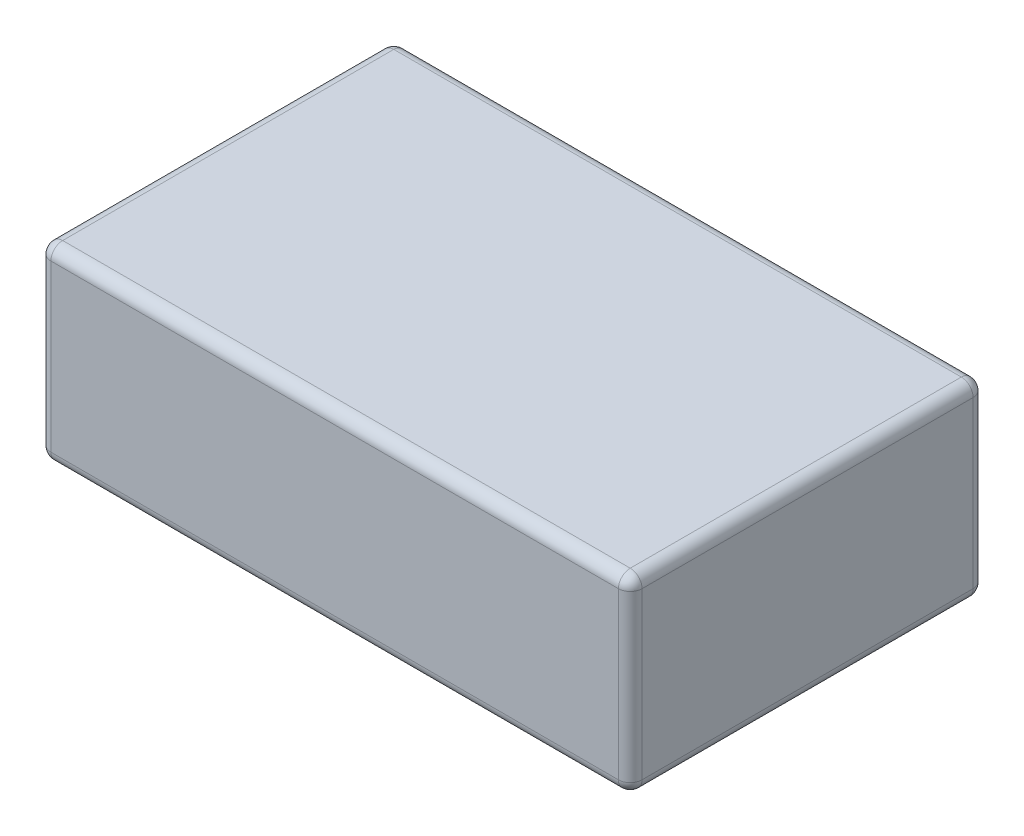
ISO-10303-21;
HEADER;
FILE_DESCRIPTION(('STEP AP214'),'2;1');
FILE_NAME('part.step','',(''),(''),'','','');
FILE_SCHEMA(('AUTOMOTIVE_DESIGN { 1 0 10303 214 1 1 1 1 }'));
ENDSEC;
DATA;
#1=APPLICATION_CONTEXT('core data for automotive mechanical design processes');
#2=APPLICATION_PROTOCOL_DEFINITION('international standard','automotive_design',2000,#1);
#3=PRODUCT_CONTEXT('',#1,'mechanical');
#4=PRODUCT('Part','Part','',(#3));
#5=PRODUCT_RELATED_PRODUCT_CATEGORY('part','',(#4));
#6=PRODUCT_DEFINITION_FORMATION('','',#4);
#7=PRODUCT_DEFINITION_CONTEXT('part definition',#1,'design');
#8=PRODUCT_DEFINITION('design','',#6,#7);
#9=PRODUCT_DEFINITION_SHAPE('','',#8);
#10=(LENGTH_UNIT() NAMED_UNIT(*) SI_UNIT(.MILLI.,.METRE.));
#11=(NAMED_UNIT(*) PLANE_ANGLE_UNIT() SI_UNIT($,.RADIAN.));
#12=(NAMED_UNIT(*) SI_UNIT($,.STERADIAN.) SOLID_ANGLE_UNIT());
#13=UNCERTAINTY_MEASURE_WITH_UNIT(LENGTH_MEASURE(1.E-05),#10,'distance_accuracy_value','');
#14=(GEOMETRIC_REPRESENTATION_CONTEXT(3) GLOBAL_UNCERTAINTY_ASSIGNED_CONTEXT((#13)) GLOBAL_UNIT_ASSIGNED_CONTEXT((#10,
#11,#12)) REPRESENTATION_CONTEXT('',''));
#15=CARTESIAN_POINT('',(0.,0.,0.));
#16=DIRECTION('',(0.,0.,1.));
#17=DIRECTION('',(1.,0.,0.));
#18=AXIS2_PLACEMENT_3D('',#15,#16,#17);
#19=CARTESIAN_POINT('',(-50.,8.,-15.));
#20=DIRECTION('',(0.,0.,-1.));
#21=DIRECTION('',(0.,1.,0.));
#22=AXIS2_PLACEMENT_3D('',#19,#20,#21);
#23=PLANE('',#22);
#24=DIRECTION('',(1.,0.,0.));
#25=VECTOR('',#24,1.);
#26=CARTESIAN_POINT('',(-50.,-7.,-15.));
#27=LINE('',#26,#25);
#28=CARTESIAN_POINT('',(-1.,-7.,-15.));
#29=VERTEX_POINT('',#28);
#30=CARTESIAN_POINT('',(-49.,-7.,-15.));
#31=VERTEX_POINT('',#30);
#32=EDGE_CURVE('E222',#29,#31,#27,.F.);
#33=ORIENTED_EDGE('',*,*,#32,.T.);
#34=DIRECTION('',(0.,1.,0.));
#35=VECTOR('',#34,1.);
#36=CARTESIAN_POINT('',(-49.,7.,-15.));
#37=LINE('',#36,#35);
#38=CARTESIAN_POINT('',(-49.,7.,-15.));
#39=VERTEX_POINT('',#38);
#40=EDGE_CURVE('E235',#31,#39,#37,.T.);
#41=ORIENTED_EDGE('',*,*,#40,.T.);
#42=DIRECTION('',(1.,0.,0.));
#43=VECTOR('',#42,1.);
#44=CARTESIAN_POINT('',(-50.,7.,-15.));
#45=LINE('',#44,#43);
#46=CARTESIAN_POINT('',(-1.,7.,-15.));
#47=VERTEX_POINT('',#46);
#48=EDGE_CURVE('E218',#39,#47,#45,.T.);
#49=ORIENTED_EDGE('',*,*,#48,.T.);
#50=DIRECTION('',(0.,1.,0.));
#51=VECTOR('',#50,1.);
#52=CARTESIAN_POINT('',(-1.,8.,-15.));
#53=LINE('',#52,#51);
#54=EDGE_CURVE('E233',#47,#29,#53,.F.);
#55=ORIENTED_EDGE('',*,*,#54,.T.);
#56=EDGE_LOOP('',(#33,#41,#49,#55));
#57=FACE_BOUND('',#56,.T.);
#58=ADVANCED_FACE('F35',(#57),#23,.T.);
#59=CARTESIAN_POINT('',(-50.,-8.,15.));
#60=DIRECTION('',(0.,-1.,0.));
#61=DIRECTION('',(0.,0.,-1.));
#62=AXIS2_PLACEMENT_3D('',#59,#60,#61);
#63=PLANE('',#62);
#64=DIRECTION('',(1.,0.,0.));
#65=VECTOR('',#64,1.);
#66=CARTESIAN_POINT('',(-50.,-8.,14.));
#67=LINE('',#66,#65);
#68=CARTESIAN_POINT('',(-1.,-8.,14.));
#69=VERTEX_POINT('',#68);
#70=CARTESIAN_POINT('',(-49.,-8.,14.));
#71=VERTEX_POINT('',#70);
#72=EDGE_CURVE('E208',#69,#71,#67,.F.);
#73=ORIENTED_EDGE('',*,*,#72,.T.);
#74=DIRECTION('',(0.,0.,-1.));
#75=VECTOR('',#74,1.);
#76=CARTESIAN_POINT('',(-49.,-8.,-14.));
#77=LINE('',#76,#75);
#78=CARTESIAN_POINT('',(-49.,-8.,-14.));
#79=VERTEX_POINT('',#78);
#80=EDGE_CURVE('E252',#71,#79,#77,.T.);
#81=ORIENTED_EDGE('',*,*,#80,.T.);
#82=DIRECTION('',(1.,0.,0.));
#83=VECTOR('',#82,1.);
#84=CARTESIAN_POINT('',(-50.,-8.,-14.));
#85=LINE('',#84,#83);
#86=CARTESIAN_POINT('',(-1.,-8.,-14.));
#87=VERTEX_POINT('',#86);
#88=EDGE_CURVE('E213',#79,#87,#85,.T.);
#89=ORIENTED_EDGE('',*,*,#88,.T.);
#90=DIRECTION('',(0.,0.,-1.));
#91=VECTOR('',#90,1.);
#92=CARTESIAN_POINT('',(-1.,-8.,15.));
#93=LINE('',#92,#91);
#94=EDGE_CURVE('E250',#87,#69,#93,.F.);
#95=ORIENTED_EDGE('',*,*,#94,.T.);
#96=EDGE_LOOP('',(#73,#81,#89,#95));
#97=FACE_BOUND('',#96,.T.);
#98=ADVANCED_FACE('F285',(#97),#63,.T.);
#99=CARTESIAN_POINT('',(-50.,8.,15.));
#100=DIRECTION('',(0.,0.,1.));
#101=DIRECTION('',(0.,-1.,0.));
#102=AXIS2_PLACEMENT_3D('',#99,#100,#101);
#103=PLANE('',#102);
#104=DIRECTION('',(1.,0.,0.));
#105=VECTOR('',#104,1.);
#106=CARTESIAN_POINT('',(-50.,7.,15.));
#107=LINE('',#106,#105);
#108=CARTESIAN_POINT('',(-1.,7.,15.));
#109=VERTEX_POINT('',#108);
#110=CARTESIAN_POINT('',(-49.,7.,15.));
#111=VERTEX_POINT('',#110);
#112=EDGE_CURVE('E225',#109,#111,#107,.F.);
#113=ORIENTED_EDGE('',*,*,#112,.T.);
#114=DIRECTION('',(0.,-1.,0.));
#115=VECTOR('',#114,1.);
#116=CARTESIAN_POINT('',(-49.,-7.,15.));
#117=LINE('',#116,#115);
#118=CARTESIAN_POINT('',(-49.,-7.,15.));
#119=VERTEX_POINT('',#118);
#120=EDGE_CURVE('E260',#111,#119,#117,.T.);
#121=ORIENTED_EDGE('',*,*,#120,.T.);
#122=DIRECTION('',(1.,0.,0.));
#123=VECTOR('',#122,1.);
#124=CARTESIAN_POINT('',(-50.,-7.,15.));
#125=LINE('',#124,#123);
#126=CARTESIAN_POINT('',(-1.,-7.,15.));
#127=VERTEX_POINT('',#126);
#128=EDGE_CURVE('E228',#119,#127,#125,.T.);
#129=ORIENTED_EDGE('',*,*,#128,.T.);
#130=DIRECTION('',(0.,-1.,0.));
#131=VECTOR('',#130,1.);
#132=CARTESIAN_POINT('',(-1.,8.,15.));
#133=LINE('',#132,#131);
#134=EDGE_CURVE('E258',#127,#109,#133,.F.);
#135=ORIENTED_EDGE('',*,*,#134,.T.);
#136=EDGE_LOOP('',(#113,#121,#129,#135));
#137=FACE_BOUND('',#136,.T.);
#138=ADVANCED_FACE('F297',(#137),#103,.T.);
#139=CARTESIAN_POINT('',(-50.,8.,15.));
#140=DIRECTION('',(0.,1.,0.));
#141=DIRECTION('',(0.,0.,1.));
#142=AXIS2_PLACEMENT_3D('',#139,#140,#141);
#143=PLANE('',#142);
#144=DIRECTION('',(1.,0.,0.));
#145=VECTOR('',#144,1.);
#146=CARTESIAN_POINT('',(-50.,8.,-14.));
#147=LINE('',#146,#145);
#148=CARTESIAN_POINT('',(-1.,8.,-14.));
#149=VERTEX_POINT('',#148);
#150=CARTESIAN_POINT('',(-49.,8.,-14.));
#151=VERTEX_POINT('',#150);
#152=EDGE_CURVE('E128',#149,#151,#147,.F.);
#153=ORIENTED_EDGE('',*,*,#152,.T.);
#154=DIRECTION('',(0.,0.,1.));
#155=VECTOR('',#154,1.);
#156=CARTESIAN_POINT('',(-49.,8.,14.));
#157=LINE('',#156,#155);
#158=CARTESIAN_POINT('',(-49.,8.,14.));
#159=VERTEX_POINT('',#158);
#160=EDGE_CURVE('E11',#151,#159,#157,.T.);
#161=ORIENTED_EDGE('',*,*,#160,.T.);
#162=DIRECTION('',(1.,0.,0.));
#163=VECTOR('',#162,1.);
#164=CARTESIAN_POINT('',(-50.,8.,14.));
#165=LINE('',#164,#163);
#166=CARTESIAN_POINT('',(-1.,8.,14.));
#167=VERTEX_POINT('',#166);
#168=EDGE_CURVE('E130',#159,#167,#165,.T.);
#169=ORIENTED_EDGE('',*,*,#168,.T.);
#170=DIRECTION('',(0.,0.,1.));
#171=VECTOR('',#170,1.);
#172=CARTESIAN_POINT('',(-1.,8.,15.));
#173=LINE('',#172,#171);
#174=EDGE_CURVE('E44',#167,#149,#173,.F.);
#175=ORIENTED_EDGE('',*,*,#174,.T.);
#176=EDGE_LOOP('',(#153,#161,#169,#175));
#177=FACE_BOUND('',#176,.T.);
#178=ADVANCED_FACE('F127',(#177),#143,.T.);
#179=CARTESIAN_POINT('',(-50.,0.,0.));
#180=DIRECTION('',(1.,0.,0.));
#181=DIRECTION('',(0.,0.,-1.));
#182=AXIS2_PLACEMENT_3D('',#179,#180,#181);
#183=PLANE('',#182);
#184=DIRECTION('',(0.,0.,1.));
#185=VECTOR('',#184,1.);
#186=CARTESIAN_POINT('',(-50.,7.,-14.));
#187=LINE('',#186,#185);
#188=CARTESIAN_POINT('',(-50.,7.,14.));
#189=VERTEX_POINT('',#188);
#190=CARTESIAN_POINT('',(-50.,7.,-14.));
#191=VERTEX_POINT('',#190);
#192=EDGE_CURVE('E237',#189,#191,#187,.F.);
#193=ORIENTED_EDGE('',*,*,#192,.T.);
#194=DIRECTION('',(0.,1.,0.));
#195=VECTOR('',#194,1.);
#196=CARTESIAN_POINT('',(-50.,-7.,-14.));
#197=LINE('',#196,#195);
#198=CARTESIAN_POINT('',(-50.,-7.,-14.));
#199=VERTEX_POINT('',#198);
#200=EDGE_CURVE('E243',#191,#199,#197,.F.);
#201=ORIENTED_EDGE('',*,*,#200,.T.);
#202=DIRECTION('',(0.,0.,-1.));
#203=VECTOR('',#202,1.);
#204=CARTESIAN_POINT('',(-50.,-7.,14.));
#205=LINE('',#204,#203);
#206=CARTESIAN_POINT('',(-50.,-7.,14.));
#207=VERTEX_POINT('',#206);
#208=EDGE_CURVE('E241',#199,#207,#205,.F.);
#209=ORIENTED_EDGE('',*,*,#208,.T.);
#210=DIRECTION('',(0.,-1.,0.));
#211=VECTOR('',#210,1.);
#212=CARTESIAN_POINT('',(-50.,7.,14.));
#213=LINE('',#212,#211);
#214=EDGE_CURVE('E239',#207,#189,#213,.F.);
#215=ORIENTED_EDGE('',*,*,#214,.T.);
#216=EDGE_LOOP('',(#193,#201,#209,#215));
#217=FACE_BOUND('',#216,.T.);
#218=ADVANCED_FACE('F312',(#217),#183,.F.);
#219=CARTESIAN_POINT('',(0.,0.,0.));
#220=DIRECTION('',(1.,0.,0.));
#221=DIRECTION('',(0.,0.,-1.));
#222=AXIS2_PLACEMENT_3D('',#219,#220,#221);
#223=PLANE('',#222);
#224=DIRECTION('',(0.,0.,-1.));
#225=VECTOR('',#224,1.);
#226=CARTESIAN_POINT('',(0.,-7.,0.));
#227=LINE('',#226,#225);
#228=CARTESIAN_POINT('',(0.,-7.,14.));
#229=VERTEX_POINT('',#228);
#230=CARTESIAN_POINT('',(0.,-7.,-14.));
#231=VERTEX_POINT('',#230);
#232=EDGE_CURVE('E52',#229,#231,#227,.T.);
#233=ORIENTED_EDGE('',*,*,#232,.T.);
#234=DIRECTION('',(0.,1.,0.));
#235=VECTOR('',#234,1.);
#236=CARTESIAN_POINT('',(0.,0.,-14.));
#237=LINE('',#236,#235);
#238=CARTESIAN_POINT('',(0.,7.,-14.));
#239=VERTEX_POINT('',#238);
#240=EDGE_CURVE('E135',#231,#239,#237,.T.);
#241=ORIENTED_EDGE('',*,*,#240,.T.);
#242=DIRECTION('',(0.,0.,1.));
#243=VECTOR('',#242,1.);
#244=CARTESIAN_POINT('',(0.,7.,0.));
#245=LINE('',#244,#243);
#246=CARTESIAN_POINT('',(0.,7.,14.));
#247=VERTEX_POINT('',#246);
#248=EDGE_CURVE('E157',#239,#247,#245,.T.);
#249=ORIENTED_EDGE('',*,*,#248,.T.);
#250=DIRECTION('',(0.,-1.,0.));
#251=VECTOR('',#250,1.);
#252=CARTESIAN_POINT('',(0.,0.,14.));
#253=LINE('',#252,#251);
#254=EDGE_CURVE('E57',#247,#229,#253,.T.);
#255=ORIENTED_EDGE('',*,*,#254,.T.);
#256=EDGE_LOOP('',(#233,#241,#249,#255));
#257=FACE_BOUND('',#256,.T.);
#258=ADVANCED_FACE('F270',(#257),#223,.T.);
#259=CARTESIAN_POINT('',(-50.,-7.,-14.));
#260=DIRECTION('',(1.,0.,0.));
#261=DIRECTION('',(0.,0.,-1.));
#262=AXIS2_PLACEMENT_3D('',#259,#260,#261);
#263=CYLINDRICAL_SURFACE('',#262,1.);
#264=ORIENTED_EDGE('',*,*,#88,.F.);
#265=CARTESIAN_POINT('',(-49.,-7.,-14.));
#266=DIRECTION('',(1.,0.,0.));
#267=DIRECTION('',(0.,0.,-1.));
#268=AXIS2_PLACEMENT_3D('',#265,#266,#267);
#269=CIRCLE('',#268,1.);
#270=EDGE_CURVE('E248',#79,#31,#269,.T.);
#271=ORIENTED_EDGE('',*,*,#270,.T.);
#272=ORIENTED_EDGE('',*,*,#32,.F.);
#273=CARTESIAN_POINT('',(-1.,-7.,-14.));
#274=DIRECTION('',(1.,0.,0.));
#275=DIRECTION('',(0.,0.,-1.));
#276=AXIS2_PLACEMENT_3D('',#273,#274,#275);
#277=CIRCLE('',#276,1.);
#278=EDGE_CURVE('E246',#29,#87,#277,.F.);
#279=ORIENTED_EDGE('',*,*,#278,.T.);
#280=EDGE_LOOP('',(#264,#271,#272,#279));
#281=FACE_BOUND('',#280,.T.);
#282=ADVANCED_FACE('F280',(#281),#263,.T.);
#283=CARTESIAN_POINT('',(-50.,-7.,14.));
#284=DIRECTION('',(1.,0.,0.));
#285=DIRECTION('',(0.,0.,-1.));
#286=AXIS2_PLACEMENT_3D('',#283,#284,#285);
#287=CYLINDRICAL_SURFACE('',#286,1.);
#288=ORIENTED_EDGE('',*,*,#128,.F.);
#289=CARTESIAN_POINT('',(-49.,-7.,14.));
#290=DIRECTION('',(1.,0.,0.));
#291=DIRECTION('',(0.,0.,-1.));
#292=AXIS2_PLACEMENT_3D('',#289,#290,#291);
#293=CIRCLE('',#292,1.);
#294=EDGE_CURVE('E256',#119,#71,#293,.T.);
#295=ORIENTED_EDGE('',*,*,#294,.T.);
#296=ORIENTED_EDGE('',*,*,#72,.F.);
#297=CARTESIAN_POINT('',(-1.,-7.,14.));
#298=DIRECTION('',(1.,0.,0.));
#299=DIRECTION('',(0.,0.,-1.));
#300=AXIS2_PLACEMENT_3D('',#297,#298,#299);
#301=CIRCLE('',#300,1.);
#302=EDGE_CURVE('E254',#69,#127,#301,.F.);
#303=ORIENTED_EDGE('',*,*,#302,.T.);
#304=EDGE_LOOP('',(#288,#295,#296,#303));
#305=FACE_BOUND('',#304,.T.);
#306=ADVANCED_FACE('F289',(#305),#287,.T.);
#307=CARTESIAN_POINT('',(-50.,7.,-14.));
#308=DIRECTION('',(1.,0.,0.));
#309=DIRECTION('',(0.,0.,-1.));
#310=AXIS2_PLACEMENT_3D('',#307,#308,#309);
#311=CYLINDRICAL_SURFACE('',#310,1.);
#312=ORIENTED_EDGE('',*,*,#48,.F.);
#313=CARTESIAN_POINT('',(-49.,7.,-14.));
#314=DIRECTION('',(1.,0.,0.));
#315=DIRECTION('',(0.,0.,-1.));
#316=AXIS2_PLACEMENT_3D('',#313,#314,#315);
#317=CIRCLE('',#316,1.);
#318=EDGE_CURVE('E146',#39,#151,#317,.T.);
#319=ORIENTED_EDGE('',*,*,#318,.T.);
#320=ORIENTED_EDGE('',*,*,#152,.F.);
#321=CARTESIAN_POINT('',(-1.,7.,-14.));
#322=DIRECTION('',(1.,0.,0.));
#323=DIRECTION('',(0.,0.,-1.));
#324=AXIS2_PLACEMENT_3D('',#321,#322,#323);
#325=CIRCLE('',#324,1.);
#326=EDGE_CURVE('E143',#149,#47,#325,.F.);
#327=ORIENTED_EDGE('',*,*,#326,.T.);
#328=EDGE_LOOP('',(#312,#319,#320,#327));
#329=FACE_BOUND('',#328,.T.);
#330=ADVANCED_FACE('F142',(#329),#311,.T.);
#331=CARTESIAN_POINT('',(-50.,7.,14.));
#332=DIRECTION('',(1.,0.,0.));
#333=DIRECTION('',(0.,0.,-1.));
#334=AXIS2_PLACEMENT_3D('',#331,#332,#333);
#335=CYLINDRICAL_SURFACE('',#334,1.);
#336=ORIENTED_EDGE('',*,*,#168,.F.);
#337=CARTESIAN_POINT('',(-49.,7.,14.));
#338=DIRECTION('',(1.,0.,0.));
#339=DIRECTION('',(0.,0.,-1.));
#340=AXIS2_PLACEMENT_3D('',#337,#338,#339);
#341=CIRCLE('',#340,1.);
#342=EDGE_CURVE('E264',#159,#111,#341,.T.);
#343=ORIENTED_EDGE('',*,*,#342,.T.);
#344=ORIENTED_EDGE('',*,*,#112,.F.);
#345=CARTESIAN_POINT('',(-1.,7.,14.));
#346=DIRECTION('',(1.,0.,0.));
#347=DIRECTION('',(0.,0.,-1.));
#348=AXIS2_PLACEMENT_3D('',#345,#346,#347);
#349=CIRCLE('',#348,1.);
#350=EDGE_CURVE('E262',#109,#167,#349,.F.);
#351=ORIENTED_EDGE('',*,*,#350,.T.);
#352=EDGE_LOOP('',(#336,#343,#344,#351));
#353=FACE_BOUND('',#352,.T.);
#354=ADVANCED_FACE('F299',(#353),#335,.T.);
#355=CARTESIAN_POINT('',(-49.,-7.,14.));
#356=DIRECTION('',(1.,0.,0.));
#357=DIRECTION('',(0.,0.,-1.));
#358=AXIS2_PLACEMENT_3D('',#355,#356,#357);
#359=SPHERICAL_SURFACE('',#358,1.);
#360=CARTESIAN_POINT('',(-49.,-7.,14.));
#361=DIRECTION('',(0.,0.,-1.));
#362=DIRECTION('',(-1.,0.,0.));
#363=AXIS2_PLACEMENT_3D('',#360,#361,#362);
#364=CIRCLE('',#363,1.);
#365=EDGE_CURVE('E200',#71,#207,#364,.T.);
#366=ORIENTED_EDGE('',*,*,#365,.F.);
#367=ORIENTED_EDGE('',*,*,#294,.F.);
#368=CARTESIAN_POINT('',(-49.,-7.,14.));
#369=DIRECTION('',(0.,1.,0.));
#370=DIRECTION('',(0.,0.,1.));
#371=AXIS2_PLACEMENT_3D('',#368,#369,#370);
#372=CIRCLE('',#371,1.);
#373=EDGE_CURVE('E162',#207,#119,#372,.T.);
#374=ORIENTED_EDGE('',*,*,#373,.F.);
#375=EDGE_LOOP('',(#366,#367,#374));
#376=FACE_BOUND('',#375,.T.);
#377=ADVANCED_FACE('F328',(#376),#359,.T.);
#378=CARTESIAN_POINT('',(-49.,8.,14.));
#379=DIRECTION('',(0.,1.,0.));
#380=DIRECTION('',(0.,0.,1.));
#381=AXIS2_PLACEMENT_3D('',#378,#379,#380);
#382=CYLINDRICAL_SURFACE('',#381,1.);
#383=ORIENTED_EDGE('',*,*,#373,.T.);
#384=ORIENTED_EDGE('',*,*,#120,.F.);
#385=CARTESIAN_POINT('',(-49.,7.,14.));
#386=DIRECTION('',(0.,1.,0.));
#387=DIRECTION('',(0.,0.,1.));
#388=AXIS2_PLACEMENT_3D('',#385,#386,#387);
#389=CIRCLE('',#388,1.);
#390=EDGE_CURVE('E198',#189,#111,#389,.T.);
#391=ORIENTED_EDGE('',*,*,#390,.F.);
#392=ORIENTED_EDGE('',*,*,#214,.F.);
#393=EDGE_LOOP('',(#383,#384,#391,#392));
#394=FACE_BOUND('',#393,.T.);
#395=ADVANCED_FACE('F321',(#394),#382,.T.);
#396=CARTESIAN_POINT('',(-49.,-7.,15.));
#397=DIRECTION('',(0.,0.,1.));
#398=DIRECTION('',(1.,0.,0.));
#399=AXIS2_PLACEMENT_3D('',#396,#397,#398);
#400=CYLINDRICAL_SURFACE('',#399,1.);
#401=ORIENTED_EDGE('',*,*,#365,.T.);
#402=ORIENTED_EDGE('',*,*,#208,.F.);
#403=CARTESIAN_POINT('',(-49.,-7.,-14.));
#404=DIRECTION('',(0.,0.,-1.));
#405=DIRECTION('',(-1.,0.,0.));
#406=AXIS2_PLACEMENT_3D('',#403,#404,#405);
#407=CIRCLE('',#406,1.);
#408=EDGE_CURVE('E195',#79,#199,#407,.T.);
#409=ORIENTED_EDGE('',*,*,#408,.F.);
#410=ORIENTED_EDGE('',*,*,#80,.F.);
#411=EDGE_LOOP('',(#401,#402,#409,#410));
#412=FACE_BOUND('',#411,.T.);
#413=ADVANCED_FACE('F319',(#412),#400,.T.);
#414=CARTESIAN_POINT('',(-49.,7.,14.));
#415=DIRECTION('',(1.,0.,0.));
#416=DIRECTION('',(0.,0.,-1.));
#417=AXIS2_PLACEMENT_3D('',#414,#415,#416);
#418=SPHERICAL_SURFACE('',#417,1.);
#419=ORIENTED_EDGE('',*,*,#390,.T.);
#420=ORIENTED_EDGE('',*,*,#342,.F.);
#421=CARTESIAN_POINT('',(-49.,7.,14.));
#422=DIRECTION('',(0.,0.,-1.));
#423=DIRECTION('',(-1.,0.,0.));
#424=AXIS2_PLACEMENT_3D('',#421,#422,#423);
#425=CIRCLE('',#424,1.);
#426=EDGE_CURVE('E192',#189,#159,#425,.T.);
#427=ORIENTED_EDGE('',*,*,#426,.F.);
#428=EDGE_LOOP('',(#419,#420,#427));
#429=FACE_BOUND('',#428,.T.);
#430=ADVANCED_FACE('F303',(#429),#418,.T.);
#431=CARTESIAN_POINT('',(-49.,-7.,-14.));
#432=DIRECTION('',(1.,0.,0.));
#433=DIRECTION('',(0.,0.,-1.));
#434=AXIS2_PLACEMENT_3D('',#431,#432,#433);
#435=SPHERICAL_SURFACE('',#434,1.);
#436=ORIENTED_EDGE('',*,*,#270,.F.);
#437=ORIENTED_EDGE('',*,*,#408,.T.);
#438=CARTESIAN_POINT('',(-49.,-7.,-14.));
#439=DIRECTION('',(0.,1.,0.));
#440=DIRECTION('',(0.,0.,1.));
#441=AXIS2_PLACEMENT_3D('',#438,#439,#440);
#442=CIRCLE('',#441,1.);
#443=EDGE_CURVE('E188',#31,#199,#442,.T.);
#444=ORIENTED_EDGE('',*,*,#443,.F.);
#445=EDGE_LOOP('',(#436,#437,#444));
#446=FACE_BOUND('',#445,.T.);
#447=ADVANCED_FACE('F318',(#446),#435,.T.);
#448=CARTESIAN_POINT('',(-49.,7.,15.));
#449=DIRECTION('',(0.,0.,-1.));
#450=DIRECTION('',(-1.,0.,0.));
#451=AXIS2_PLACEMENT_3D('',#448,#449,#450);
#452=CYLINDRICAL_SURFACE('',#451,1.);
#453=ORIENTED_EDGE('',*,*,#426,.T.);
#454=ORIENTED_EDGE('',*,*,#160,.F.);
#455=CARTESIAN_POINT('',(-49.,7.,-14.));
#456=DIRECTION('',(0.,0.,-1.));
#457=DIRECTION('',(-1.,0.,0.));
#458=AXIS2_PLACEMENT_3D('',#455,#456,#457);
#459=CIRCLE('',#458,1.);
#460=EDGE_CURVE('E184',#191,#151,#459,.T.);
#461=ORIENTED_EDGE('',*,*,#460,.F.);
#462=ORIENTED_EDGE('',*,*,#192,.F.);
#463=EDGE_LOOP('',(#453,#454,#461,#462));
#464=FACE_BOUND('',#463,.T.);
#465=ADVANCED_FACE('F308',(#464),#452,.T.);
#466=CARTESIAN_POINT('',(-49.,8.,-14.));
#467=DIRECTION('',(0.,-1.,0.));
#468=DIRECTION('',(0.,0.,-1.));
#469=AXIS2_PLACEMENT_3D('',#466,#467,#468);
#470=CYLINDRICAL_SURFACE('',#469,1.);
#471=ORIENTED_EDGE('',*,*,#443,.T.);
#472=ORIENTED_EDGE('',*,*,#200,.F.);
#473=CARTESIAN_POINT('',(-49.,7.,-14.));
#474=DIRECTION('',(0.,1.,0.));
#475=DIRECTION('',(0.,0.,1.));
#476=AXIS2_PLACEMENT_3D('',#473,#474,#475);
#477=CIRCLE('',#476,1.);
#478=EDGE_CURVE('E180',#39,#191,#477,.T.);
#479=ORIENTED_EDGE('',*,*,#478,.F.);
#480=ORIENTED_EDGE('',*,*,#40,.F.);
#481=EDGE_LOOP('',(#471,#472,#479,#480));
#482=FACE_BOUND('',#481,.T.);
#483=ADVANCED_FACE('F314',(#482),#470,.T.);
#484=CARTESIAN_POINT('',(-49.,7.,-14.));
#485=DIRECTION('',(1.,0.,0.));
#486=DIRECTION('',(0.,0.,-1.));
#487=AXIS2_PLACEMENT_3D('',#484,#485,#486);
#488=SPHERICAL_SURFACE('',#487,1.);
#489=ORIENTED_EDGE('',*,*,#460,.T.);
#490=ORIENTED_EDGE('',*,*,#318,.F.);
#491=ORIENTED_EDGE('',*,*,#478,.T.);
#492=EDGE_LOOP('',(#489,#490,#491));
#493=FACE_BOUND('',#492,.T.);
#494=ADVANCED_FACE('F347',(#493),#488,.T.);
#495=CARTESIAN_POINT('',(-1.,-7.,14.));
#496=DIRECTION('',(1.,0.,0.));
#497=DIRECTION('',(0.,0.,-1.));
#498=AXIS2_PLACEMENT_3D('',#495,#496,#497);
#499=SPHERICAL_SURFACE('',#498,1.);
#500=CARTESIAN_POINT('',(-1.,-7.,14.));
#501=DIRECTION('',(0.,1.,0.));
#502=DIRECTION('',(0.,0.,1.));
#503=AXIS2_PLACEMENT_3D('',#500,#501,#502);
#504=CIRCLE('',#503,1.);
#505=EDGE_CURVE('E174',#127,#229,#504,.T.);
#506=ORIENTED_EDGE('',*,*,#505,.F.);
#507=ORIENTED_EDGE('',*,*,#302,.F.);
#508=CARTESIAN_POINT('',(-1.,-7.,14.));
#509=DIRECTION('',(0.,0.,-1.));
#510=DIRECTION('',(-1.,0.,0.));
#511=AXIS2_PLACEMENT_3D('',#508,#509,#510);
#512=CIRCLE('',#511,1.);
#513=EDGE_CURVE('E39',#229,#69,#512,.T.);
#514=ORIENTED_EDGE('',*,*,#513,.F.);
#515=EDGE_LOOP('',(#506,#507,#514));
#516=FACE_BOUND('',#515,.T.);
#517=ADVANCED_FACE('F37',(#516),#499,.T.);
#518=CARTESIAN_POINT('',(-1.,-7.,0.));
#519=DIRECTION('',(0.,0.,-1.));
#520=DIRECTION('',(-1.,0.,0.));
#521=AXIS2_PLACEMENT_3D('',#518,#519,#520);
#522=CYLINDRICAL_SURFACE('',#521,1.);
#523=ORIENTED_EDGE('',*,*,#513,.T.);
#524=ORIENTED_EDGE('',*,*,#94,.F.);
#525=CARTESIAN_POINT('',(-1.,-7.,-14.));
#526=DIRECTION('',(0.,0.,-1.));
#527=DIRECTION('',(-1.,0.,0.));
#528=AXIS2_PLACEMENT_3D('',#525,#526,#527);
#529=CIRCLE('',#528,1.);
#530=EDGE_CURVE('E172',#231,#87,#529,.T.);
#531=ORIENTED_EDGE('',*,*,#530,.F.);
#532=ORIENTED_EDGE('',*,*,#232,.F.);
#533=EDGE_LOOP('',(#523,#524,#531,#532));
#534=FACE_BOUND('',#533,.T.);
#535=ADVANCED_FACE('F284',(#534),#522,.T.);
#536=CARTESIAN_POINT('',(-1.,0.,14.));
#537=DIRECTION('',(0.,-1.,0.));
#538=DIRECTION('',(0.,0.,-1.));
#539=AXIS2_PLACEMENT_3D('',#536,#537,#538);
#540=CYLINDRICAL_SURFACE('',#539,1.);
#541=ORIENTED_EDGE('',*,*,#505,.T.);
#542=ORIENTED_EDGE('',*,*,#254,.F.);
#543=CARTESIAN_POINT('',(-1.,7.,14.));
#544=DIRECTION('',(0.,1.,0.));
#545=DIRECTION('',(0.,0.,1.));
#546=AXIS2_PLACEMENT_3D('',#543,#544,#545);
#547=CIRCLE('',#546,1.);
#548=EDGE_CURVE('E169',#109,#247,#547,.T.);
#549=ORIENTED_EDGE('',*,*,#548,.F.);
#550=ORIENTED_EDGE('',*,*,#134,.F.);
#551=EDGE_LOOP('',(#541,#542,#549,#550));
#552=FACE_BOUND('',#551,.T.);
#553=ADVANCED_FACE('F293',(#552),#540,.T.);
#554=CARTESIAN_POINT('',(-1.,-7.,-14.));
#555=DIRECTION('',(1.,0.,0.));
#556=DIRECTION('',(0.,0.,-1.));
#557=AXIS2_PLACEMENT_3D('',#554,#555,#556);
#558=SPHERICAL_SURFACE('',#557,1.);
#559=ORIENTED_EDGE('',*,*,#530,.T.);
#560=ORIENTED_EDGE('',*,*,#278,.F.);
#561=CARTESIAN_POINT('',(-1.,-7.,-14.));
#562=DIRECTION('',(0.,1.,0.));
#563=DIRECTION('',(0.,0.,1.));
#564=AXIS2_PLACEMENT_3D('',#561,#562,#563);
#565=CIRCLE('',#564,1.);
#566=EDGE_CURVE('E166',#231,#29,#565,.T.);
#567=ORIENTED_EDGE('',*,*,#566,.F.);
#568=EDGE_LOOP('',(#559,#560,#567));
#569=FACE_BOUND('',#568,.T.);
#570=ADVANCED_FACE('F283',(#569),#558,.T.);
#571=CARTESIAN_POINT('',(-1.,7.,14.));
#572=DIRECTION('',(1.,0.,0.));
#573=DIRECTION('',(0.,0.,-1.));
#574=AXIS2_PLACEMENT_3D('',#571,#572,#573);
#575=SPHERICAL_SURFACE('',#574,1.);
#576=ORIENTED_EDGE('',*,*,#350,.F.);
#577=ORIENTED_EDGE('',*,*,#548,.T.);
#578=CARTESIAN_POINT('',(-1.,7.,14.));
#579=DIRECTION('',(0.,0.,-1.));
#580=DIRECTION('',(-1.,0.,0.));
#581=AXIS2_PLACEMENT_3D('',#578,#579,#580);
#582=CIRCLE('',#581,1.);
#583=EDGE_CURVE('E159',#167,#247,#582,.T.);
#584=ORIENTED_EDGE('',*,*,#583,.F.);
#585=EDGE_LOOP('',(#576,#577,#584));
#586=FACE_BOUND('',#585,.T.);
#587=ADVANCED_FACE('F393',(#586),#575,.T.);
#588=CARTESIAN_POINT('',(-1.,0.,-14.));
#589=DIRECTION('',(0.,1.,0.));
#590=DIRECTION('',(0.,0.,1.));
#591=AXIS2_PLACEMENT_3D('',#588,#589,#590);
#592=CYLINDRICAL_SURFACE('',#591,1.);
#593=ORIENTED_EDGE('',*,*,#566,.T.);
#594=ORIENTED_EDGE('',*,*,#54,.F.);
#595=CARTESIAN_POINT('',(-1.,7.,-14.));
#596=DIRECTION('',(0.,1.,0.));
#597=DIRECTION('',(0.,0.,1.));
#598=AXIS2_PLACEMENT_3D('',#595,#596,#597);
#599=CIRCLE('',#598,1.);
#600=EDGE_CURVE('E152',#239,#47,#599,.T.);
#601=ORIENTED_EDGE('',*,*,#600,.F.);
#602=ORIENTED_EDGE('',*,*,#240,.F.);
#603=EDGE_LOOP('',(#593,#594,#601,#602));
#604=FACE_BOUND('',#603,.T.);
#605=ADVANCED_FACE('F272',(#604),#592,.T.);
#606=CARTESIAN_POINT('',(-1.,7.,0.));
#607=DIRECTION('',(0.,0.,1.));
#608=DIRECTION('',(1.,0.,0.));
#609=AXIS2_PLACEMENT_3D('',#606,#607,#608);
#610=CYLINDRICAL_SURFACE('',#609,1.);
#611=ORIENTED_EDGE('',*,*,#583,.T.);
#612=ORIENTED_EDGE('',*,*,#248,.F.);
#613=CARTESIAN_POINT('',(-1.,7.,-14.));
#614=DIRECTION('',(0.,0.,-1.));
#615=DIRECTION('',(-1.,0.,0.));
#616=AXIS2_PLACEMENT_3D('',#613,#614,#615);
#617=CIRCLE('',#616,1.);
#618=EDGE_CURVE('E150',#149,#239,#617,.T.);
#619=ORIENTED_EDGE('',*,*,#618,.F.);
#620=ORIENTED_EDGE('',*,*,#174,.F.);
#621=EDGE_LOOP('',(#611,#612,#619,#620));
#622=FACE_BOUND('',#621,.T.);
#623=ADVANCED_FACE('F156',(#622),#610,.T.);
#624=CARTESIAN_POINT('',(-1.,7.,-14.));
#625=DIRECTION('',(1.,0.,0.));
#626=DIRECTION('',(0.,0.,-1.));
#627=AXIS2_PLACEMENT_3D('',#624,#625,#626);
#628=SPHERICAL_SURFACE('',#627,1.);
#629=ORIENTED_EDGE('',*,*,#600,.T.);
#630=ORIENTED_EDGE('',*,*,#326,.F.);
#631=ORIENTED_EDGE('',*,*,#618,.T.);
#632=EDGE_LOOP('',(#629,#630,#631));
#633=FACE_BOUND('',#632,.T.);
#634=ADVANCED_FACE('F149',(#633),#628,.T.);
#635=CLOSED_SHELL('',(#58,#98,#138,#178,#218,#258,#282,#306,#330,#354,#377,#395,#413,#430,#447,
#465,#483,#494,#517,#535,#553,#570,#587,#605,#623,#634));
#636=MANIFOLD_SOLID_BREP('B2',#635);
#637=ADVANCED_BREP_SHAPE_REPRESENTATION('',(#18,#636),#14);
#638=SHAPE_DEFINITION_REPRESENTATION(#9,#637);
ENDSEC;
END-ISO-10303-21;
